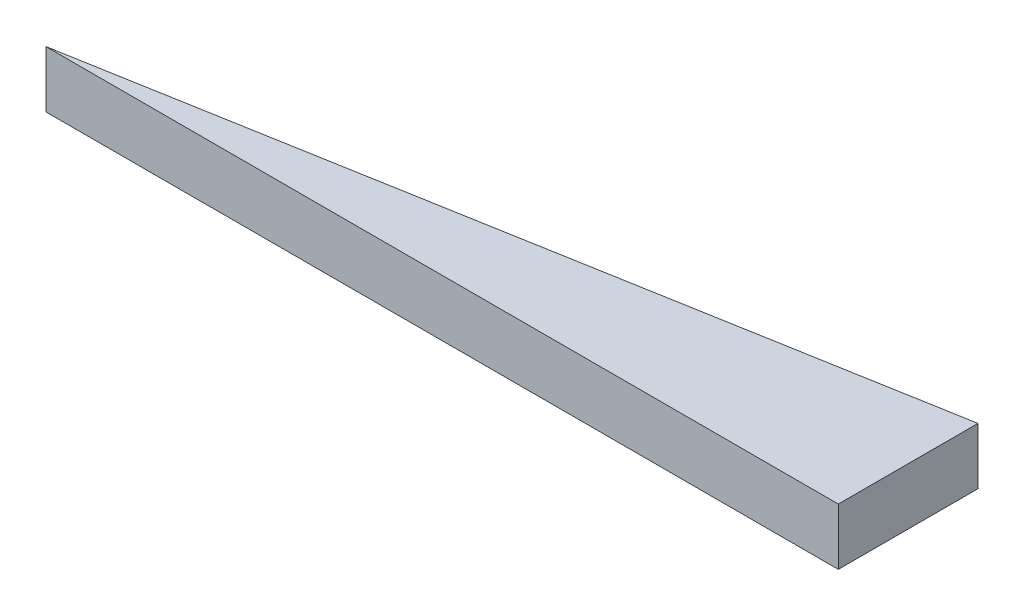
ISO-10303-21;
HEADER;
FILE_DESCRIPTION(('STEP AP214'),'2;1');
FILE_NAME('part.step','',(''),(''),'','','');
FILE_SCHEMA(('AUTOMOTIVE_DESIGN { 1 0 10303 214 1 1 1 1 }'));
ENDSEC;
DATA;
#1=APPLICATION_CONTEXT('core data for automotive mechanical design processes');
#2=APPLICATION_PROTOCOL_DEFINITION('international standard','automotive_design',2000,#1);
#3=PRODUCT_CONTEXT('',#1,'mechanical');
#4=PRODUCT('Part','Part','',(#3));
#5=PRODUCT_RELATED_PRODUCT_CATEGORY('part','',(#4));
#6=PRODUCT_DEFINITION_FORMATION('','',#4);
#7=PRODUCT_DEFINITION_CONTEXT('part definition',#1,'design');
#8=PRODUCT_DEFINITION('design','',#6,#7);
#9=PRODUCT_DEFINITION_SHAPE('','',#8);
#10=(LENGTH_UNIT() NAMED_UNIT(*) SI_UNIT(.MILLI.,.METRE.));
#11=(NAMED_UNIT(*) PLANE_ANGLE_UNIT() SI_UNIT($,.RADIAN.));
#12=(NAMED_UNIT(*) SI_UNIT($,.STERADIAN.) SOLID_ANGLE_UNIT());
#13=UNCERTAINTY_MEASURE_WITH_UNIT(LENGTH_MEASURE(1.E-05),#10,'distance_accuracy_value','');
#14=(GEOMETRIC_REPRESENTATION_CONTEXT(3) GLOBAL_UNCERTAINTY_ASSIGNED_CONTEXT((#13)) GLOBAL_UNIT_ASSIGNED_CONTEXT((#10,
#11,#12)) REPRESENTATION_CONTEXT('',''));
#15=CARTESIAN_POINT('',(0.,0.,0.));
#16=DIRECTION('',(0.,0.,1.));
#17=DIRECTION('',(1.,0.,0.));
#18=AXIS2_PLACEMENT_3D('',#15,#16,#17);
#19=CARTESIAN_POINT('',(177.8,12.7,-31.3509371699638));
#20=DIRECTION('',(0.173648177666924,0.,0.984807753012209));
#21=DIRECTION('',(0.984807753012209,0.,-0.173648177666924));
#22=AXIS2_PLACEMENT_3D('',#19,#20,#21);
#23=PLANE('',#22);
#24=DIRECTION('',(-0.984807753012209,0.,0.173648177666924));
#25=VECTOR('',#24,1.);
#26=CARTESIAN_POINT('',(177.8,0.,-31.3509371699638));
#27=LINE('',#26,#25);
#28=CARTESIAN_POINT('',(177.8,0.,-31.3509371699638));
#29=VERTEX_POINT('',#28);
#30=CARTESIAN_POINT('',(0.,0.,0.));
#31=VERTEX_POINT('',#30);
#32=EDGE_CURVE('E95',#29,#31,#27,.T.);
#33=ORIENTED_EDGE('',*,*,#32,.T.);
#34=DIRECTION('',(0.,-1.,0.));
#35=VECTOR('',#34,1.);
#36=CARTESIAN_POINT('',(0.,12.7,0.));
#37=LINE('',#36,#35);
#38=CARTESIAN_POINT('',(0.,12.7,0.));
#39=VERTEX_POINT('',#38);
#40=EDGE_CURVE('E11',#39,#31,#37,.T.);
#41=ORIENTED_EDGE('',*,*,#40,.F.);
#42=DIRECTION('',(-0.984807753012209,0.,0.173648177666924));
#43=VECTOR('',#42,1.);
#44=CARTESIAN_POINT('',(177.8,12.7,-31.3509371699638));
#45=LINE('',#44,#43);
#46=CARTESIAN_POINT('',(177.8,12.7,-31.3509371699638));
#47=VERTEX_POINT('',#46);
#48=EDGE_CURVE('E87',#47,#39,#45,.T.);
#49=ORIENTED_EDGE('',*,*,#48,.F.);
#50=DIRECTION('',(0.,-1.,0.));
#51=VECTOR('',#50,1.);
#52=CARTESIAN_POINT('',(177.8,12.7,-31.3509371699638));
#53=LINE('',#52,#51);
#54=EDGE_CURVE('E96',#47,#29,#53,.T.);
#55=ORIENTED_EDGE('',*,*,#54,.T.);
#56=EDGE_LOOP('',(#33,#41,#49,#55));
#57=FACE_BOUND('',#56,.T.);
#58=ADVANCED_FACE('F45',(#57),#23,.F.);
#59=CARTESIAN_POINT('',(0.,12.7,0.));
#60=DIRECTION('',(0.,0.,-1.));
#61=DIRECTION('',(-1.,0.,0.));
#62=AXIS2_PLACEMENT_3D('',#59,#60,#61);
#63=PLANE('',#62);
#64=DIRECTION('',(1.,0.,0.));
#65=VECTOR('',#64,1.);
#66=CARTESIAN_POINT('',(0.,0.,0.));
#67=LINE('',#66,#65);
#68=CARTESIAN_POINT('',(177.8,0.,0.));
#69=VERTEX_POINT('',#68);
#70=EDGE_CURVE('E74',#31,#69,#67,.T.);
#71=ORIENTED_EDGE('',*,*,#70,.T.);
#72=DIRECTION('',(0.,-1.,0.));
#73=VECTOR('',#72,1.);
#74=CARTESIAN_POINT('',(177.8,12.7,0.));
#75=LINE('',#74,#73);
#76=CARTESIAN_POINT('',(177.8,12.7,0.));
#77=VERTEX_POINT('',#76);
#78=EDGE_CURVE('E54',#77,#69,#75,.T.);
#79=ORIENTED_EDGE('',*,*,#78,.F.);
#80=DIRECTION('',(1.,0.,0.));
#81=VECTOR('',#80,1.);
#82=CARTESIAN_POINT('',(0.,12.7,0.));
#83=LINE('',#82,#81);
#84=EDGE_CURVE('E82',#39,#77,#83,.T.);
#85=ORIENTED_EDGE('',*,*,#84,.F.);
#86=ORIENTED_EDGE('',*,*,#40,.T.);
#87=EDGE_LOOP('',(#71,#79,#85,#86));
#88=FACE_BOUND('',#87,.T.);
#89=ADVANCED_FACE('F83',(#88),#63,.F.);
#90=CARTESIAN_POINT('',(177.8,12.7,0.));
#91=DIRECTION('',(-1.,0.,0.));
#92=DIRECTION('',(0.,0.,1.));
#93=AXIS2_PLACEMENT_3D('',#90,#91,#92);
#94=PLANE('',#93);
#95=DIRECTION('',(0.,0.,-1.));
#96=VECTOR('',#95,1.);
#97=CARTESIAN_POINT('',(177.8,0.,0.));
#98=LINE('',#97,#96);
#99=EDGE_CURVE('E79',#69,#29,#98,.T.);
#100=ORIENTED_EDGE('',*,*,#99,.T.);
#101=ORIENTED_EDGE('',*,*,#54,.F.);
#102=DIRECTION('',(0.,0.,-1.));
#103=VECTOR('',#102,1.);
#104=CARTESIAN_POINT('',(177.8,12.7,0.));
#105=LINE('',#104,#103);
#106=EDGE_CURVE('E62',#77,#47,#105,.T.);
#107=ORIENTED_EDGE('',*,*,#106,.F.);
#108=ORIENTED_EDGE('',*,*,#78,.T.);
#109=EDGE_LOOP('',(#100,#101,#107,#108));
#110=FACE_BOUND('',#109,.T.);
#111=ADVANCED_FACE('F108',(#110),#94,.F.);
#112=CARTESIAN_POINT('',(0.,12.7,0.));
#113=DIRECTION('',(0.,-1.,0.));
#114=DIRECTION('',(0.,0.,-1.));
#115=AXIS2_PLACEMENT_3D('',#112,#113,#114);
#116=PLANE('',#115);
#117=ORIENTED_EDGE('',*,*,#48,.T.);
#118=ORIENTED_EDGE('',*,*,#84,.T.);
#119=ORIENTED_EDGE('',*,*,#106,.T.);
#120=EDGE_LOOP('',(#117,#118,#119));
#121=FACE_BOUND('',#120,.T.);
#122=ADVANCED_FACE('F90',(#121),#116,.F.);
#123=CARTESIAN_POINT('',(0.,0.,0.));
#124=DIRECTION('',(0.,-1.,0.));
#125=DIRECTION('',(0.,0.,-1.));
#126=AXIS2_PLACEMENT_3D('',#123,#124,#125);
#127=PLANE('',#126);
#128=ORIENTED_EDGE('',*,*,#32,.F.);
#129=ORIENTED_EDGE('',*,*,#99,.F.);
#130=ORIENTED_EDGE('',*,*,#70,.F.);
#131=EDGE_LOOP('',(#128,#129,#130));
#132=FACE_BOUND('',#131,.T.);
#133=ADVANCED_FACE('F109',(#132),#127,.T.);
#134=CLOSED_SHELL('',(#58,#89,#111,#122,#133));
#135=MANIFOLD_SOLID_BREP('B2',#134);
#136=ADVANCED_BREP_SHAPE_REPRESENTATION('',(#18,#135),#14);
#137=SHAPE_DEFINITION_REPRESENTATION(#9,#136);
ENDSEC;
END-ISO-10303-21;
